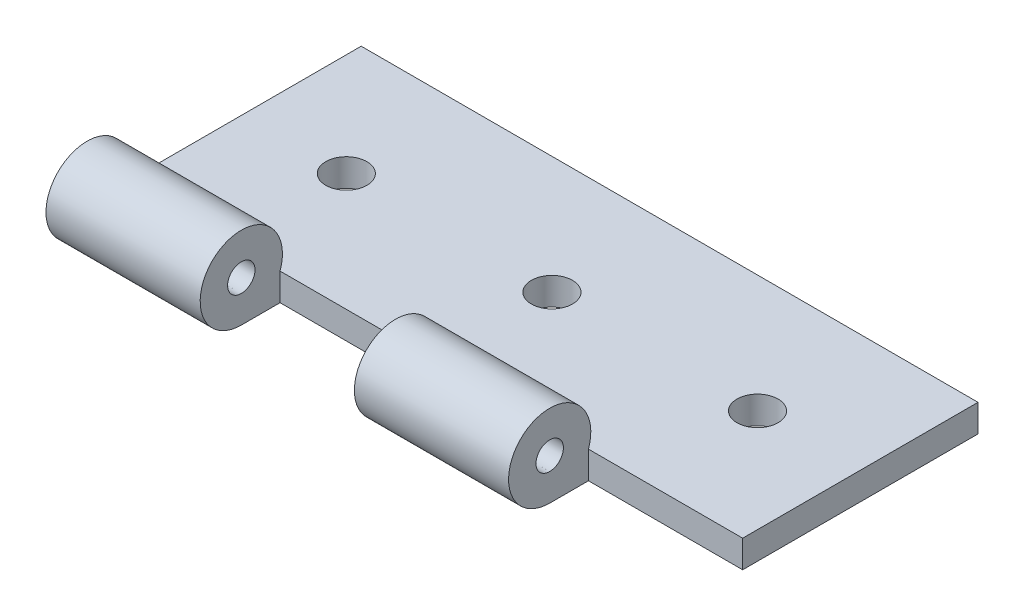
ISO-10303-21;
HEADER;
FILE_DESCRIPTION(('STEP AP214'),'2;1');
FILE_NAME('part.step','',(''),(''),'','','');
FILE_SCHEMA(('AUTOMOTIVE_DESIGN { 1 0 10303 214 1 1 1 1 }'));
ENDSEC;
DATA;
#1=APPLICATION_CONTEXT('core data for automotive mechanical design processes');
#2=APPLICATION_PROTOCOL_DEFINITION('international standard','automotive_design',2000,#1);
#3=PRODUCT_CONTEXT('',#1,'mechanical');
#4=PRODUCT('Part','Part','',(#3));
#5=PRODUCT_RELATED_PRODUCT_CATEGORY('part','',(#4));
#6=PRODUCT_DEFINITION_FORMATION('','',#4);
#7=PRODUCT_DEFINITION_CONTEXT('part definition',#1,'design');
#8=PRODUCT_DEFINITION('design','',#6,#7);
#9=PRODUCT_DEFINITION_SHAPE('','',#8);
#10=(LENGTH_UNIT() NAMED_UNIT(*) SI_UNIT(.MILLI.,.METRE.));
#11=(NAMED_UNIT(*) PLANE_ANGLE_UNIT() SI_UNIT($,.RADIAN.));
#12=(NAMED_UNIT(*) SI_UNIT($,.STERADIAN.) SOLID_ANGLE_UNIT());
#13=UNCERTAINTY_MEASURE_WITH_UNIT(LENGTH_MEASURE(1.E-05),#10,'distance_accuracy_value','');
#14=(GEOMETRIC_REPRESENTATION_CONTEXT(3) GLOBAL_UNCERTAINTY_ASSIGNED_CONTEXT((#13)) GLOBAL_UNIT_ASSIGNED_CONTEXT((#10,
#11,#12)) REPRESENTATION_CONTEXT('',''));
#15=CARTESIAN_POINT('',(0.,0.,0.));
#16=DIRECTION('',(0.,0.,1.));
#17=DIRECTION('',(1.,0.,0.));
#18=AXIS2_PLACEMENT_3D('',#15,#16,#17);
#19=CARTESIAN_POINT('',(0.,2.,0.));
#20=DIRECTION('',(0.,-1.,0.));
#21=DIRECTION('',(0.,0.,-1.));
#22=AXIS2_PLACEMENT_3D('',#19,#20,#21);
#23=PLANE('',#22);
#24=DIRECTION('',(0.,0.,1.));
#25=VECTOR('',#24,1.);
#26=CARTESIAN_POINT('',(-11.25,2.,0.));
#27=LINE('',#26,#25);
#28=CARTESIAN_POINT('',(-11.25,1.99999842928128,9.99693009611205));
#29=VERTEX_POINT('',#28);
#30=CARTESIAN_POINT('',(-11.25,2.,10.));
#31=VERTEX_POINT('',#30);
#32=EDGE_CURVE('E55',#29,#31,#27,.T.);
#33=ORIENTED_EDGE('',*,*,#32,.F.);
#34=DIRECTION('',(1.,0.,0.));
#35=VECTOR('',#34,1.);
#36=CARTESIAN_POINT('',(-22.5,1.99999921464064,9.99693009611205));
#37=LINE('',#36,#35);
#38=CARTESIAN_POINT('',(-22.5,2.,9.99693009611205));
#39=VERTEX_POINT('',#38);
#40=EDGE_CURVE('E191',#39,#29,#37,.T.);
#41=ORIENTED_EDGE('',*,*,#40,.F.);
#42=DIRECTION('',(0.,0.,1.));
#43=VECTOR('',#42,1.);
#44=CARTESIAN_POINT('',(-22.5,2.,10.));
#45=LINE('',#44,#43);
#46=CARTESIAN_POINT('',(-22.5,2.,10.));
#47=VERTEX_POINT('',#46);
#48=EDGE_CURVE('E173',#39,#47,#45,.T.);
#49=ORIENTED_EDGE('',*,*,#48,.T.);
#50=DIRECTION('',(1.,0.,0.));
#51=VECTOR('',#50,1.);
#52=CARTESIAN_POINT('',(-22.5,2.,10.));
#53=LINE('',#52,#51);
#54=EDGE_CURVE('E176',#47,#31,#53,.T.);
#55=ORIENTED_EDGE('',*,*,#54,.T.);
#56=EDGE_LOOP('',(#33,#41,#49,#55));
#57=FACE_BOUND('',#56,.T.);
#58=ADVANCED_FACE('F34',(#57),#23,.F.);
#59=CARTESIAN_POINT('',(0.,0.,0.));
#60=DIRECTION('',(0.,-1.,0.));
#61=DIRECTION('',(0.,0.,-1.));
#62=AXIS2_PLACEMENT_3D('',#59,#60,#61);
#63=PLANE('',#62);
#64=CARTESIAN_POINT('',(0.,0.,-1.41574879198329));
#65=DIRECTION('',(0.,-1.,0.));
#66=DIRECTION('',(0.,0.,-1.));
#67=AXIS2_PLACEMENT_3D('',#64,#65,#66);
#68=CIRCLE('',#67,1.5);
#69=CARTESIAN_POINT('',(0.,0.,0.0842512080167154));
#70=VERTEX_POINT('',#69);
#71=EDGE_CURVE('E236',#70,#70,#68,.T.);
#72=ORIENTED_EDGE('',*,*,#71,.F.);
#73=EDGE_LOOP('',(#72));
#74=FACE_BOUND('',#73,.T.);
#75=CARTESIAN_POINT('',(-15.,0.,-1.41574879198329));
#76=DIRECTION('',(0.,-1.,0.));
#77=DIRECTION('',(0.,0.,-1.));
#78=AXIS2_PLACEMENT_3D('',#75,#76,#77);
#79=CIRCLE('',#78,1.5);
#80=CARTESIAN_POINT('',(-15.,0.,0.0842512080167154));
#81=VERTEX_POINT('',#80);
#82=EDGE_CURVE('E194',#81,#81,#79,.T.);
#83=ORIENTED_EDGE('',*,*,#82,.F.);
#84=EDGE_LOOP('',(#83));
#85=FACE_BOUND('',#84,.T.);
#86=CARTESIAN_POINT('',(15.,0.,-1.41574879198329));
#87=DIRECTION('',(0.,-1.,0.));
#88=DIRECTION('',(0.,0.,-1.));
#89=AXIS2_PLACEMENT_3D('',#86,#87,#88);
#90=CIRCLE('',#89,1.5);
#91=CARTESIAN_POINT('',(15.,0.,0.0842512080167154));
#92=VERTEX_POINT('',#91);
#93=EDGE_CURVE('E42',#92,#92,#90,.T.);
#94=ORIENTED_EDGE('',*,*,#93,.F.);
#95=EDGE_LOOP('',(#94));
#96=FACE_BOUND('',#95,.T.);
#97=DIRECTION('',(1.,0.,0.));
#98=VECTOR('',#97,1.);
#99=CARTESIAN_POINT('',(-11.25,0.,7.16850241603342));
#100=LINE('',#99,#98);
#101=CARTESIAN_POINT('',(-11.25,0.,7.16850241603342));
#102=VERTEX_POINT('',#101);
#103=CARTESIAN_POINT('',(0.,0.,7.16850241603342));
#104=VERTEX_POINT('',#103);
#105=EDGE_CURVE('E136',#102,#104,#100,.T.);
#106=ORIENTED_EDGE('',*,*,#105,.F.);
#107=DIRECTION('',(0.,0.,-1.));
#108=VECTOR('',#107,1.);
#109=CARTESIAN_POINT('',(-11.25,0.,0.));
#110=LINE('',#109,#108);
#111=CARTESIAN_POINT('',(-11.25,0.,10.));
#112=VERTEX_POINT('',#111);
#113=EDGE_CURVE('E143',#112,#102,#110,.T.);
#114=ORIENTED_EDGE('',*,*,#113,.F.);
#115=DIRECTION('',(1.,0.,0.));
#116=VECTOR('',#115,1.);
#117=CARTESIAN_POINT('',(-22.5,0.,10.));
#118=LINE('',#117,#116);
#119=CARTESIAN_POINT('',(-22.5,0.,10.));
#120=VERTEX_POINT('',#119);
#121=EDGE_CURVE('E154',#120,#112,#118,.T.);
#122=ORIENTED_EDGE('',*,*,#121,.F.);
#123=DIRECTION('',(0.,0.,1.));
#124=VECTOR('',#123,1.);
#125=CARTESIAN_POINT('',(-22.5,0.,10.));
#126=LINE('',#125,#124);
#127=CARTESIAN_POINT('',(-22.5,0.,-10.));
#128=VERTEX_POINT('',#127);
#129=EDGE_CURVE('E181',#128,#120,#126,.T.);
#130=ORIENTED_EDGE('',*,*,#129,.F.);
#131=DIRECTION('',(-1.,0.,0.));
#132=VECTOR('',#131,1.);
#133=CARTESIAN_POINT('',(-22.5,0.,-10.));
#134=LINE('',#133,#132);
#135=CARTESIAN_POINT('',(22.5,0.,-10.));
#136=VERTEX_POINT('',#135);
#137=EDGE_CURVE('E163',#136,#128,#134,.T.);
#138=ORIENTED_EDGE('',*,*,#137,.F.);
#139=DIRECTION('',(0.,0.,-1.));
#140=VECTOR('',#139,1.);
#141=CARTESIAN_POINT('',(22.5,0.,10.));
#142=LINE('',#141,#140);
#143=CARTESIAN_POINT('',(22.5,0.,7.16850241603342));
#144=VERTEX_POINT('',#143);
#145=EDGE_CURVE('E160',#144,#136,#142,.T.);
#146=ORIENTED_EDGE('',*,*,#145,.F.);
#147=DIRECTION('',(1.,0.,0.));
#148=VECTOR('',#147,1.);
#149=CARTESIAN_POINT('',(11.25,0.,7.16850241603342));
#150=LINE('',#149,#148);
#151=CARTESIAN_POINT('',(11.25,0.,7.16850241603342));
#152=VERTEX_POINT('',#151);
#153=EDGE_CURVE('E234',#152,#144,#150,.T.);
#154=ORIENTED_EDGE('',*,*,#153,.F.);
#155=DIRECTION('',(0.,0.,-1.));
#156=VECTOR('',#155,1.);
#157=CARTESIAN_POINT('',(11.25,0.,0.));
#158=LINE('',#157,#156);
#159=CARTESIAN_POINT('',(11.25,0.,10.));
#160=VERTEX_POINT('',#159);
#161=EDGE_CURVE('E224',#160,#152,#158,.T.);
#162=ORIENTED_EDGE('',*,*,#161,.F.);
#163=CARTESIAN_POINT('',(0.,0.,10.));
#164=VERTEX_POINT('',#163);
#165=EDGE_CURVE('E183',#164,#160,#118,.T.);
#166=ORIENTED_EDGE('',*,*,#165,.F.);
#167=DIRECTION('',(0.,0.,-1.));
#168=VECTOR('',#167,1.);
#169=CARTESIAN_POINT('',(0.,0.,0.));
#170=LINE('',#169,#168);
#171=EDGE_CURVE('E211',#164,#104,#170,.T.);
#172=ORIENTED_EDGE('',*,*,#171,.T.);
#173=EDGE_LOOP('',(#106,#114,#122,#130,#138,#146,#154,#162,#166,#172));
#174=FACE_BOUND('',#173,.T.);
#175=ADVANCED_FACE('F203',(#74,#85,#96,#174),#63,.T.);
#176=CARTESIAN_POINT('',(-22.5,2.99999842928128,9.99693009611205));
#177=DIRECTION('',(1.,0.,0.));
#178=DIRECTION('',(0.,0.,-1.));
#179=AXIS2_PLACEMENT_3D('',#176,#177,#178);
#180=CYLINDRICAL_SURFACE('',#179,1.);
#181=CARTESIAN_POINT('',(-11.25,2.99999842928128,9.99693009611205));
#182=DIRECTION('',(1.,0.,0.));
#183=DIRECTION('',(0.,0.,-1.));
#184=AXIS2_PLACEMENT_3D('',#181,#182,#183);
#185=CIRCLE('',#184,1.);
#186=EDGE_CURVE('E340',#31,#29,#185,.F.);
#187=ORIENTED_EDGE('',*,*,#186,.F.);
#188=ORIENTED_EDGE('',*,*,#54,.F.);
#189=CARTESIAN_POINT('',(-22.5,2.99999842928128,9.99693009611205));
#190=DIRECTION('',(1.,0.,0.));
#191=DIRECTION('',(0.,0.,-1.));
#192=AXIS2_PLACEMENT_3D('',#189,#190,#191);
#193=CIRCLE('',#192,1.);
#194=EDGE_CURVE('E196',#39,#47,#193,.T.);
#195=ORIENTED_EDGE('',*,*,#194,.F.);
#196=ORIENTED_EDGE('',*,*,#40,.T.);
#197=EDGE_LOOP('',(#187,#188,#195,#196));
#198=FACE_BOUND('',#197,.T.);
#199=ADVANCED_FACE('F206',(#198),#180,.F.);
#200=CARTESIAN_POINT('',(-22.5,2.99999842928128,9.99693009611205));
#201=DIRECTION('',(1.,0.,0.));
#202=DIRECTION('',(0.,0.,-1.));
#203=AXIS2_PLACEMENT_3D('',#200,#201,#202);
#204=CYLINDRICAL_SURFACE('',#203,3.);
#205=ORIENTED_EDGE('',*,*,#121,.T.);
#206=CARTESIAN_POINT('',(-11.25,2.99999842928128,9.99693009611205));
#207=DIRECTION('',(1.,0.,0.));
#208=DIRECTION('',(0.,0.,-1.));
#209=AXIS2_PLACEMENT_3D('',#206,#207,#208);
#210=CIRCLE('',#209,3.);
#211=CARTESIAN_POINT('',(-11.25,2.,7.16850241603342));
#212=VERTEX_POINT('',#211);
#213=EDGE_CURVE('E141',#212,#112,#210,.T.);
#214=ORIENTED_EDGE('',*,*,#213,.F.);
#215=DIRECTION('',(1.,0.,0.));
#216=VECTOR('',#215,1.);
#217=CARTESIAN_POINT('',(-22.5,2.,7.16850241603342));
#218=LINE('',#217,#216);
#219=CARTESIAN_POINT('',(-22.5,2.,7.16850241603342));
#220=VERTEX_POINT('',#219);
#221=EDGE_CURVE('E151',#220,#212,#218,.T.);
#222=ORIENTED_EDGE('',*,*,#221,.F.);
#223=CARTESIAN_POINT('',(-22.5,2.99999842928128,9.99693009611205));
#224=DIRECTION('',(1.,0.,0.));
#225=DIRECTION('',(0.,0.,-1.));
#226=AXIS2_PLACEMENT_3D('',#223,#224,#225);
#227=CIRCLE('',#226,3.);
#228=EDGE_CURVE('E165',#220,#120,#227,.T.);
#229=ORIENTED_EDGE('',*,*,#228,.T.);
#230=EDGE_LOOP('',(#205,#214,#222,#229));
#231=FACE_BOUND('',#230,.T.);
#232=ADVANCED_FACE('F149',(#231),#204,.T.);
#233=CARTESIAN_POINT('',(0.,1.99999921464064,9.99693009611205));
#234=VERTEX_POINT('',#233);
#235=CARTESIAN_POINT('',(11.25,1.99999842928128,9.99693009611205));
#236=VERTEX_POINT('',#235);
#237=EDGE_CURVE('E190',#234,#236,#37,.T.);
#238=ORIENTED_EDGE('',*,*,#237,.F.);
#239=DIRECTION('',(0.,0.,1.));
#240=VECTOR('',#239,1.);
#241=CARTESIAN_POINT('',(0.,2.,0.));
#242=LINE('',#241,#240);
#243=CARTESIAN_POINT('',(0.,2.00000314141771,9.99999999035613));
#244=VERTEX_POINT('',#243);
#245=EDGE_CURVE('E48',#234,#244,#242,.T.);
#246=ORIENTED_EDGE('',*,*,#245,.T.);
#247=CARTESIAN_POINT('',(11.25,2.,10.));
#248=VERTEX_POINT('',#247);
#249=EDGE_CURVE('E175',#244,#248,#53,.T.);
#250=ORIENTED_EDGE('',*,*,#249,.T.);
#251=DIRECTION('',(0.,0.,1.));
#252=VECTOR('',#251,1.);
#253=CARTESIAN_POINT('',(11.25,2.,0.));
#254=LINE('',#253,#252);
#255=EDGE_CURVE('E230',#236,#248,#254,.T.);
#256=ORIENTED_EDGE('',*,*,#255,.F.);
#257=EDGE_LOOP('',(#238,#246,#250,#256));
#258=FACE_BOUND('',#257,.T.);
#259=ADVANCED_FACE('F287',(#258),#23,.F.);
#260=CARTESIAN_POINT('',(22.5,2.,10.));
#261=DIRECTION('',(-1.,0.,0.));
#262=DIRECTION('',(0.,0.,1.));
#263=AXIS2_PLACEMENT_3D('',#260,#261,#262);
#264=PLANE('',#263);
#265=DIRECTION('',(0.,-1.,0.));
#266=VECTOR('',#265,1.);
#267=CARTESIAN_POINT('',(22.5,0.,7.16850241603342));
#268=LINE('',#267,#266);
#269=CARTESIAN_POINT('',(22.5,2.,7.16850241603342));
#270=VERTEX_POINT('',#269);
#271=EDGE_CURVE('E212',#270,#144,#268,.T.);
#272=ORIENTED_EDGE('',*,*,#271,.T.);
#273=ORIENTED_EDGE('',*,*,#145,.T.);
#274=DIRECTION('',(0.,-1.,0.));
#275=VECTOR('',#274,1.);
#276=CARTESIAN_POINT('',(22.5,2.,-10.));
#277=LINE('',#276,#275);
#278=CARTESIAN_POINT('',(22.5,2.,-10.));
#279=VERTEX_POINT('',#278);
#280=EDGE_CURVE('E187',#279,#136,#277,.T.);
#281=ORIENTED_EDGE('',*,*,#280,.F.);
#282=DIRECTION('',(0.,0.,-1.));
#283=VECTOR('',#282,1.);
#284=CARTESIAN_POINT('',(22.5,2.,10.));
#285=LINE('',#284,#283);
#286=EDGE_CURVE('E169',#270,#279,#285,.T.);
#287=ORIENTED_EDGE('',*,*,#286,.F.);
#288=EDGE_LOOP('',(#272,#273,#281,#287));
#289=FACE_BOUND('',#288,.T.);
#290=ADVANCED_FACE('F262',(#289),#264,.F.);
#291=ORIENTED_EDGE('',*,*,#249,.F.);
#292=CARTESIAN_POINT('',(0.,2.99999842928128,9.99693009611205));
#293=DIRECTION('',(1.,0.,0.));
#294=DIRECTION('',(0.,0.,-1.));
#295=AXIS2_PLACEMENT_3D('',#292,#293,#294);
#296=CIRCLE('',#295,1.);
#297=EDGE_CURVE('E279',#244,#234,#296,.F.);
#298=ORIENTED_EDGE('',*,*,#297,.T.);
#299=ORIENTED_EDGE('',*,*,#237,.T.);
#300=CARTESIAN_POINT('',(11.25,2.99999842928128,9.99693009611205));
#301=DIRECTION('',(1.,0.,0.));
#302=DIRECTION('',(0.,0.,-1.));
#303=AXIS2_PLACEMENT_3D('',#300,#301,#302);
#304=CIRCLE('',#303,1.);
#305=EDGE_CURVE('E227',#248,#236,#304,.F.);
#306=ORIENTED_EDGE('',*,*,#305,.F.);
#307=EDGE_LOOP('',(#291,#298,#299,#306));
#308=FACE_BOUND('',#307,.T.);
#309=ADVANCED_FACE('F290',(#308),#180,.F.);
#310=CARTESIAN_POINT('',(0.,2.99999842928128,9.99693009611205));
#311=DIRECTION('',(1.,0.,0.));
#312=DIRECTION('',(0.,0.,-1.));
#313=AXIS2_PLACEMENT_3D('',#310,#311,#312);
#314=CIRCLE('',#313,3.);
#315=CARTESIAN_POINT('',(0.,2.,7.16850241603342));
#316=VERTEX_POINT('',#315);
#317=EDGE_CURVE('E276',#316,#164,#314,.T.);
#318=ORIENTED_EDGE('',*,*,#317,.T.);
#319=ORIENTED_EDGE('',*,*,#165,.T.);
#320=CARTESIAN_POINT('',(11.25,2.99999842928128,9.99693009611205));
#321=DIRECTION('',(1.,0.,0.));
#322=DIRECTION('',(0.,0.,-1.));
#323=AXIS2_PLACEMENT_3D('',#320,#321,#322);
#324=CIRCLE('',#323,3.);
#325=CARTESIAN_POINT('',(11.25,2.,7.16850241603342));
#326=VERTEX_POINT('',#325);
#327=EDGE_CURVE('E221',#326,#160,#324,.T.);
#328=ORIENTED_EDGE('',*,*,#327,.F.);
#329=EDGE_CURVE('E161',#316,#326,#218,.T.);
#330=ORIENTED_EDGE('',*,*,#329,.F.);
#331=EDGE_LOOP('',(#318,#319,#328,#330));
#332=FACE_BOUND('',#331,.T.);
#333=ADVANCED_FACE('F275',(#332),#204,.T.);
#334=CARTESIAN_POINT('',(15.,-43.,-1.41574879198329));
#335=DIRECTION('',(0.,1.,0.));
#336=DIRECTION('',(0.,0.,1.));
#337=AXIS2_PLACEMENT_3D('',#334,#335,#336);
#338=CYLINDRICAL_SURFACE('',#337,1.5);
#339=CARTESIAN_POINT('',(15.,2.,-1.41574879198329));
#340=DIRECTION('',(0.,1.,0.));
#341=DIRECTION('',(0.,0.,1.));
#342=AXIS2_PLACEMENT_3D('',#339,#340,#341);
#343=CIRCLE('',#342,1.5);
#344=CARTESIAN_POINT('',(15.,1.99999999999999,0.0842512080167154));
#345=VERTEX_POINT('',#344);
#346=EDGE_CURVE('E12',#345,#345,#343,.T.);
#347=CARTESIAN_POINT('',(15.,0.,0.0842512080167154));
#348=CARTESIAN_POINT('',(15.,0.0208333333333403,0.0842512080167154));
#349=CARTESIAN_POINT('',(15.,0.0416666666666736,0.0842512080167154));
#350=CARTESIAN_POINT('',(15.,0.0833333333333404,0.0842512080167154));
#351=CARTESIAN_POINT('',(15.,0.104166666666674,0.0842512080167154));
#352=CARTESIAN_POINT('',(15.,0.14583333333334,0.0842512080167154));
#353=CARTESIAN_POINT('',(15.,0.166666666666674,0.0842512080167154));
#354=CARTESIAN_POINT('',(15.,0.20833333333334,0.0842512080167154));
#355=CARTESIAN_POINT('',(15.,0.229166666666674,0.0842512080167154));
#356=CARTESIAN_POINT('',(15.,0.270833333333341,0.0842512080167154));
#357=CARTESIAN_POINT('',(15.,0.291666666666674,0.0842512080167154));
#358=CARTESIAN_POINT('',(15.,0.333333333333341,0.0842512080167154));
#359=CARTESIAN_POINT('',(15.,0.354166666666674,0.0842512080167154));
#360=CARTESIAN_POINT('',(15.,0.395833333333341,0.0842512080167154));
#361=CARTESIAN_POINT('',(15.,0.416666666666674,0.0842512080167154));
#362=CARTESIAN_POINT('',(15.,0.458333333333341,0.0842512080167154));
#363=CARTESIAN_POINT('',(15.,0.479166666666674,0.0842512080167154));
#364=CARTESIAN_POINT('',(15.,0.520833333333338,0.0842512080167154));
#365=CARTESIAN_POINT('',(15.,0.541666666666669,0.0842512080167154));
#366=CARTESIAN_POINT('',(15.,0.583333333333334,0.0842512080167154));
#367=CARTESIAN_POINT('',(15.,0.604166666666667,0.0842512080167154));
#368=CARTESIAN_POINT('',(15.,0.645833333333334,0.0842512080167154));
#369=CARTESIAN_POINT('',(15.,0.666666666666667,0.0842512080167154));
#370=CARTESIAN_POINT('',(15.,0.708333333333334,0.0842512080167154));
#371=CARTESIAN_POINT('',(15.,0.729166666666667,0.0842512080167154));
#372=CARTESIAN_POINT('',(15.,0.770833333333334,0.0842512080167154));
#373=CARTESIAN_POINT('',(15.,0.791666666666667,0.0842512080167154));
#374=CARTESIAN_POINT('',(15.,0.833333333333334,0.0842512080167154));
#375=CARTESIAN_POINT('',(15.,0.854166666666667,0.0842512080167154));
#376=CARTESIAN_POINT('',(15.,0.895833333333334,0.0842512080167154));
#377=CARTESIAN_POINT('',(15.,0.916666666666668,0.0842512080167154));
#378=CARTESIAN_POINT('',(15.,0.958333333333334,0.0842512080167154));
#379=CARTESIAN_POINT('',(15.,0.979166666666668,0.0842512080167154));
#380=CARTESIAN_POINT('',(15.,1.02083333333333,0.0842512080167154));
#381=CARTESIAN_POINT('',(15.,1.04166666666667,0.0842512080167154));
#382=CARTESIAN_POINT('',(15.,1.08333333333333,0.0842512080167154));
#383=CARTESIAN_POINT('',(15.,1.10416666666667,0.0842512080167154));
#384=CARTESIAN_POINT('',(15.,1.14583333333333,0.0842512080167154));
#385=CARTESIAN_POINT('',(15.,1.16666666666667,0.0842512080167154));
#386=CARTESIAN_POINT('',(15.,1.20833333333333,0.0842512080167154));
#387=CARTESIAN_POINT('',(15.,1.22916666666667,0.0842512080167154));
#388=CARTESIAN_POINT('',(15.,1.27083333333333,0.0842512080167154));
#389=CARTESIAN_POINT('',(15.,1.29166666666667,0.0842512080167154));
#390=CARTESIAN_POINT('',(15.,1.33333333333333,0.0842512080167154));
#391=CARTESIAN_POINT('',(15.,1.35416666666667,0.0842512080167154));
#392=CARTESIAN_POINT('',(15.,1.39583333333333,0.0842512080167154));
#393=CARTESIAN_POINT('',(15.,1.41666666666667,0.0842512080167154));
#394=CARTESIAN_POINT('',(15.,1.45833333333333,0.0842512080167154));
#395=CARTESIAN_POINT('',(15.,1.47916666666666,0.0842512080167154));
#396=CARTESIAN_POINT('',(15.,1.52083333333333,0.0842512080167154));
#397=CARTESIAN_POINT('',(15.,1.54166666666666,0.0842512080167154));
#398=CARTESIAN_POINT('',(15.,1.58333333333333,0.0842512080167154));
#399=CARTESIAN_POINT('',(15.,1.60416666666666,0.0842512080167154));
#400=CARTESIAN_POINT('',(15.,1.64583333333333,0.0842512080167154));
#401=CARTESIAN_POINT('',(15.,1.66666666666666,0.0842512080167154));
#402=CARTESIAN_POINT('',(15.,1.70833333333333,0.0842512080167154));
#403=CARTESIAN_POINT('',(15.,1.72916666666666,0.0842512080167154));
#404=CARTESIAN_POINT('',(15.,1.77083333333333,0.0842512080167154));
#405=CARTESIAN_POINT('',(15.,1.79166666666666,0.0842512080167154));
#406=CARTESIAN_POINT('',(15.,1.83333333333333,0.0842512080167154));
#407=CARTESIAN_POINT('',(15.,1.85416666666666,0.0842512080167154));
#408=CARTESIAN_POINT('',(15.,1.89583333333333,0.0842512080167154));
#409=CARTESIAN_POINT('',(15.,1.91666666666666,0.0842512080167154));
#410=CARTESIAN_POINT('',(15.,1.95833333333333,0.0842512080167154));
#411=CARTESIAN_POINT('',(15.,1.97916666666666,0.0842512080167154));
#412=CARTESIAN_POINT('',(15.,1.99999999999999,0.0842512080167154));
#413=B_SPLINE_CURVE_WITH_KNOTS('',3,(#347,#348,#349,#350,#351,#352,#353,#354,#355,#356,#357,
#358,#359,#360,#361,#362,#363,#364,#365,#366,#367,#368,#369,#370,#371,#372,#373,#374,#375,#376,
#377,#378,#379,#380,#381,#382,#383,#384,#385,#386,#387,#388,#389,#390,#391,#392,#393,#394,#395,
#396,#397,#398,#399,#400,#401,#402,#403,#404,#405,#406,#407,#408,#409,#410,#411,#412),
.UNSPECIFIED.,.F.,.F.,(4,2,2,2,2,2,2,2,2,2,2,2,2,2,2,2,2,2,2,2,2,2,2,2,2,2,2,2,2,2,2,2,4),(0.,
0.0625000000000001,0.125,0.1875,0.25,0.3125,0.375,0.4375,0.5,0.562499999999994,
0.624999999999994,0.687499999999994,0.749999999999994,0.812499999999994,0.874999999999994,
0.937499999999994,0.999999999999994,1.06249999999999,1.12499999999999,1.18749999999999,
1.24999999999999,1.31249999999999,1.37499999999999,1.43749999999999,1.49999999999999,
1.56249999999999,1.62499999999999,1.68749999999999,1.74999999999999,1.81249999999999,
1.87499999999999,1.93749999999999,1.99999999999999),.UNSPECIFIED.);
#414=EDGE_CURVE('BSEAM36',#92,#345,#413,.T.);
#415=ORIENTED_EDGE('',*,*,#93,.T.);
#416=ORIENTED_EDGE('',*,*,#346,.T.);
#417=ORIENTED_EDGE('',*,*,#414,.T.);
#418=ORIENTED_EDGE('',*,*,#414,.F.);
#419=EDGE_LOOP('',(#415,#417,#416,#418));
#420=FACE_BOUND('',#419,.T.);
#421=ADVANCED_FACE('F36',(#420),#338,.F.);
#422=CARTESIAN_POINT('',(-22.5,2.,-10.));
#423=DIRECTION('',(0.,0.,1.));
#424=DIRECTION('',(1.,0.,0.));
#425=AXIS2_PLACEMENT_3D('',#422,#423,#424);
#426=PLANE('',#425);
#427=ORIENTED_EDGE('',*,*,#137,.T.);
#428=DIRECTION('',(0.,-1.,0.));
#429=VECTOR('',#428,1.);
#430=CARTESIAN_POINT('',(-22.5,2.,-10.));
#431=LINE('',#430,#429);
#432=CARTESIAN_POINT('',(-22.5,2.,-10.));
#433=VERTEX_POINT('',#432);
#434=EDGE_CURVE('E178',#433,#128,#431,.T.);
#435=ORIENTED_EDGE('',*,*,#434,.F.);
#436=DIRECTION('',(-1.,0.,0.));
#437=VECTOR('',#436,1.);
#438=CARTESIAN_POINT('',(-22.5,2.,-10.));
#439=LINE('',#438,#437);
#440=EDGE_CURVE('E171',#279,#433,#439,.T.);
#441=ORIENTED_EDGE('',*,*,#440,.F.);
#442=ORIENTED_EDGE('',*,*,#280,.T.);
#443=EDGE_LOOP('',(#427,#435,#441,#442));
#444=FACE_BOUND('',#443,.T.);
#445=ADVANCED_FACE('F258',(#444),#426,.F.);
#446=CARTESIAN_POINT('',(-22.5,2.,10.));
#447=DIRECTION('',(1.,0.,0.));
#448=DIRECTION('',(0.,0.,-1.));
#449=AXIS2_PLACEMENT_3D('',#446,#447,#448);
#450=PLANE('',#449);
#451=ORIENTED_EDGE('',*,*,#129,.T.);
#452=ORIENTED_EDGE('',*,*,#228,.F.);
#453=EDGE_CURVE('E159',#433,#220,#45,.T.);
#454=ORIENTED_EDGE('',*,*,#453,.F.);
#455=ORIENTED_EDGE('',*,*,#434,.T.);
#456=EDGE_LOOP('',(#451,#452,#454,#455));
#457=FACE_BOUND('',#456,.T.);
#458=ORIENTED_EDGE('',*,*,#194,.T.);
#459=ORIENTED_EDGE('',*,*,#48,.F.);
#460=EDGE_LOOP('',(#458,#459));
#461=FACE_BOUND('',#460,.T.);
#462=ADVANCED_FACE('F254',(#457,#461),#450,.F.);
#463=CARTESIAN_POINT('',(0.,2.,-1.41574879198329));
#464=DIRECTION('',(0.,1.,0.));
#465=DIRECTION('',(0.,0.,1.));
#466=AXIS2_PLACEMENT_3D('',#463,#464,#465);
#467=CIRCLE('',#466,1.5);
#468=CARTESIAN_POINT('',(0.,1.99999999999999,0.0842512080167154));
#469=VERTEX_POINT('',#468);
#470=EDGE_CURVE('E241',#469,#469,#467,.T.);
#471=ORIENTED_EDGE('',*,*,#470,.F.);
#472=EDGE_LOOP('',(#471));
#473=FACE_BOUND('',#472,.T.);
#474=CARTESIAN_POINT('',(-15.,2.,-1.41574879198329));
#475=DIRECTION('',(0.,1.,0.));
#476=DIRECTION('',(0.,0.,1.));
#477=AXIS2_PLACEMENT_3D('',#474,#475,#476);
#478=CIRCLE('',#477,1.5);
#479=CARTESIAN_POINT('',(-15.,1.99999999999999,0.0842512080167154));
#480=VERTEX_POINT('',#479);
#481=EDGE_CURVE('E197',#480,#480,#478,.T.);
#482=ORIENTED_EDGE('',*,*,#481,.F.);
#483=EDGE_LOOP('',(#482));
#484=FACE_BOUND('',#483,.T.);
#485=ORIENTED_EDGE('',*,*,#453,.T.);
#486=ORIENTED_EDGE('',*,*,#221,.T.);
#487=DIRECTION('',(1.,0.,0.));
#488=VECTOR('',#487,1.);
#489=CARTESIAN_POINT('',(-11.25,2.,7.16850241603342));
#490=LINE('',#489,#488);
#491=EDGE_CURVE('E126',#212,#316,#490,.T.);
#492=ORIENTED_EDGE('',*,*,#491,.T.);
#493=ORIENTED_EDGE('',*,*,#329,.T.);
#494=DIRECTION('',(1.,0.,0.));
#495=VECTOR('',#494,1.);
#496=CARTESIAN_POINT('',(11.25,2.,7.16850241603342));
#497=LINE('',#496,#495);
#498=EDGE_CURVE('E232',#326,#270,#497,.T.);
#499=ORIENTED_EDGE('',*,*,#498,.T.);
#500=ORIENTED_EDGE('',*,*,#286,.T.);
#501=ORIENTED_EDGE('',*,*,#440,.T.);
#502=EDGE_LOOP('',(#485,#486,#492,#493,#499,#500,#501));
#503=FACE_BOUND('',#502,.T.);
#504=ORIENTED_EDGE('',*,*,#346,.F.);
#505=EDGE_LOOP('',(#504));
#506=FACE_BOUND('',#505,.T.);
#507=ADVANCED_FACE('F156',(#473,#484,#503,#506),#23,.F.);
#508=CARTESIAN_POINT('',(-15.,-43.,-1.41574879198329));
#509=DIRECTION('',(0.,1.,0.));
#510=DIRECTION('',(0.,0.,1.));
#511=AXIS2_PLACEMENT_3D('',#508,#509,#510);
#512=CYLINDRICAL_SURFACE('',#511,1.5);
#513=CARTESIAN_POINT('',(-15.,0.,0.0842512080167154));
#514=CARTESIAN_POINT('',(-15.,0.0208333333333403,0.0842512080167154));
#515=CARTESIAN_POINT('',(-15.,0.0416666666666736,0.0842512080167154));
#516=CARTESIAN_POINT('',(-15.,0.0833333333333404,0.0842512080167154));
#517=CARTESIAN_POINT('',(-15.,0.104166666666674,0.0842512080167154));
#518=CARTESIAN_POINT('',(-15.,0.14583333333334,0.0842512080167154));
#519=CARTESIAN_POINT('',(-15.,0.166666666666674,0.0842512080167154));
#520=CARTESIAN_POINT('',(-15.,0.20833333333334,0.0842512080167154));
#521=CARTESIAN_POINT('',(-15.,0.229166666666674,0.0842512080167154));
#522=CARTESIAN_POINT('',(-15.,0.270833333333341,0.0842512080167154));
#523=CARTESIAN_POINT('',(-15.,0.291666666666674,0.0842512080167154));
#524=CARTESIAN_POINT('',(-15.,0.333333333333341,0.0842512080167154));
#525=CARTESIAN_POINT('',(-15.,0.354166666666674,0.0842512080167154));
#526=CARTESIAN_POINT('',(-15.,0.395833333333341,0.0842512080167154));
#527=CARTESIAN_POINT('',(-15.,0.416666666666674,0.0842512080167154));
#528=CARTESIAN_POINT('',(-15.,0.458333333333341,0.0842512080167154));
#529=CARTESIAN_POINT('',(-15.,0.479166666666674,0.0842512080167154));
#530=CARTESIAN_POINT('',(-15.,0.520833333333338,0.0842512080167154));
#531=CARTESIAN_POINT('',(-15.,0.541666666666669,0.0842512080167154));
#532=CARTESIAN_POINT('',(-15.,0.583333333333334,0.0842512080167154));
#533=CARTESIAN_POINT('',(-15.,0.604166666666667,0.0842512080167154));
#534=CARTESIAN_POINT('',(-15.,0.645833333333334,0.0842512080167154));
#535=CARTESIAN_POINT('',(-15.,0.666666666666667,0.0842512080167154));
#536=CARTESIAN_POINT('',(-15.,0.708333333333334,0.0842512080167154));
#537=CARTESIAN_POINT('',(-15.,0.729166666666667,0.0842512080167154));
#538=CARTESIAN_POINT('',(-15.,0.770833333333334,0.0842512080167154));
#539=CARTESIAN_POINT('',(-15.,0.791666666666667,0.0842512080167154));
#540=CARTESIAN_POINT('',(-15.,0.833333333333334,0.0842512080167154));
#541=CARTESIAN_POINT('',(-15.,0.854166666666667,0.0842512080167154));
#542=CARTESIAN_POINT('',(-15.,0.895833333333334,0.0842512080167154));
#543=CARTESIAN_POINT('',(-15.,0.916666666666668,0.0842512080167154));
#544=CARTESIAN_POINT('',(-15.,0.958333333333334,0.0842512080167154));
#545=CARTESIAN_POINT('',(-15.,0.979166666666668,0.0842512080167154));
#546=CARTESIAN_POINT('',(-15.,1.02083333333333,0.0842512080167154));
#547=CARTESIAN_POINT('',(-15.,1.04166666666667,0.0842512080167154));
#548=CARTESIAN_POINT('',(-15.,1.08333333333333,0.0842512080167154));
#549=CARTESIAN_POINT('',(-15.,1.10416666666667,0.0842512080167154));
#550=CARTESIAN_POINT('',(-15.,1.14583333333333,0.0842512080167154));
#551=CARTESIAN_POINT('',(-15.,1.16666666666667,0.0842512080167154));
#552=CARTESIAN_POINT('',(-15.,1.20833333333333,0.0842512080167154));
#553=CARTESIAN_POINT('',(-15.,1.22916666666667,0.0842512080167154));
#554=CARTESIAN_POINT('',(-15.,1.27083333333333,0.0842512080167154));
#555=CARTESIAN_POINT('',(-15.,1.29166666666667,0.0842512080167154));
#556=CARTESIAN_POINT('',(-15.,1.33333333333333,0.0842512080167154));
#557=CARTESIAN_POINT('',(-15.,1.35416666666667,0.0842512080167154));
#558=CARTESIAN_POINT('',(-15.,1.39583333333333,0.0842512080167154));
#559=CARTESIAN_POINT('',(-15.,1.41666666666667,0.0842512080167154));
#560=CARTESIAN_POINT('',(-15.,1.45833333333333,0.0842512080167154));
#561=CARTESIAN_POINT('',(-15.,1.47916666666666,0.0842512080167154));
#562=CARTESIAN_POINT('',(-15.,1.52083333333333,0.0842512080167154));
#563=CARTESIAN_POINT('',(-15.,1.54166666666666,0.0842512080167154));
#564=CARTESIAN_POINT('',(-15.,1.58333333333333,0.0842512080167154));
#565=CARTESIAN_POINT('',(-15.,1.60416666666666,0.0842512080167154));
#566=CARTESIAN_POINT('',(-15.,1.64583333333333,0.0842512080167154));
#567=CARTESIAN_POINT('',(-15.,1.66666666666666,0.0842512080167154));
#568=CARTESIAN_POINT('',(-15.,1.70833333333333,0.0842512080167154));
#569=CARTESIAN_POINT('',(-15.,1.72916666666666,0.0842512080167154));
#570=CARTESIAN_POINT('',(-15.,1.77083333333333,0.0842512080167154));
#571=CARTESIAN_POINT('',(-15.,1.79166666666666,0.0842512080167154));
#572=CARTESIAN_POINT('',(-15.,1.83333333333333,0.0842512080167154));
#573=CARTESIAN_POINT('',(-15.,1.85416666666666,0.0842512080167154));
#574=CARTESIAN_POINT('',(-15.,1.89583333333333,0.0842512080167154));
#575=CARTESIAN_POINT('',(-15.,1.91666666666666,0.0842512080167154));
#576=CARTESIAN_POINT('',(-15.,1.95833333333333,0.0842512080167154));
#577=CARTESIAN_POINT('',(-15.,1.97916666666666,0.0842512080167154));
#578=CARTESIAN_POINT('',(-15.,1.99999999999999,0.0842512080167154));
#579=B_SPLINE_CURVE_WITH_KNOTS('',3,(#513,#514,#515,#516,#517,#518,#519,#520,#521,#522,#523,
#524,#525,#526,#527,#528,#529,#530,#531,#532,#533,#534,#535,#536,#537,#538,#539,#540,#541,#542,
#543,#544,#545,#546,#547,#548,#549,#550,#551,#552,#553,#554,#555,#556,#557,#558,#559,#560,#561,
#562,#563,#564,#565,#566,#567,#568,#569,#570,#571,#572,#573,#574,#575,#576,#577,#578),
.UNSPECIFIED.,.F.,.F.,(4,2,2,2,2,2,2,2,2,2,2,2,2,2,2,2,2,2,2,2,2,2,2,2,2,2,2,2,2,2,2,2,4),(0.,
0.0625000000000001,0.125,0.1875,0.25,0.3125,0.375,0.4375,0.5,0.562499999999994,
0.624999999999994,0.687499999999994,0.749999999999994,0.812499999999994,0.874999999999994,
0.937499999999994,0.999999999999994,1.06249999999999,1.12499999999999,1.18749999999999,
1.24999999999999,1.31249999999999,1.37499999999999,1.43749999999999,1.49999999999999,
1.56249999999999,1.62499999999999,1.68749999999999,1.74999999999999,1.81249999999999,
1.87499999999999,1.93749999999999,1.99999999999999),.UNSPECIFIED.);
#580=EDGE_CURVE('BSEAM308',#81,#480,#579,.T.);
#581=ORIENTED_EDGE('',*,*,#82,.T.);
#582=ORIENTED_EDGE('',*,*,#481,.T.);
#583=ORIENTED_EDGE('',*,*,#580,.T.);
#584=ORIENTED_EDGE('',*,*,#580,.F.);
#585=EDGE_LOOP('',(#581,#583,#582,#584));
#586=FACE_BOUND('',#585,.T.);
#587=ADVANCED_FACE('F308',(#586),#512,.F.);
#588=CARTESIAN_POINT('',(0.,-43.,-1.41574879198329));
#589=DIRECTION('',(0.,1.,0.));
#590=DIRECTION('',(0.,0.,1.));
#591=AXIS2_PLACEMENT_3D('',#588,#589,#590);
#592=CYLINDRICAL_SURFACE('',#591,1.5);
#593=CARTESIAN_POINT('',(0.,0.,0.0842512080167154));
#594=CARTESIAN_POINT('',(0.,0.0208333333333403,0.0842512080167154));
#595=CARTESIAN_POINT('',(0.,0.0416666666666736,0.0842512080167154));
#596=CARTESIAN_POINT('',(0.,0.0833333333333404,0.0842512080167154));
#597=CARTESIAN_POINT('',(0.,0.104166666666674,0.0842512080167154));
#598=CARTESIAN_POINT('',(0.,0.14583333333334,0.0842512080167154));
#599=CARTESIAN_POINT('',(0.,0.166666666666674,0.0842512080167154));
#600=CARTESIAN_POINT('',(0.,0.20833333333334,0.0842512080167154));
#601=CARTESIAN_POINT('',(0.,0.229166666666674,0.0842512080167154));
#602=CARTESIAN_POINT('',(0.,0.270833333333341,0.0842512080167154));
#603=CARTESIAN_POINT('',(0.,0.291666666666674,0.0842512080167154));
#604=CARTESIAN_POINT('',(0.,0.333333333333341,0.0842512080167154));
#605=CARTESIAN_POINT('',(0.,0.354166666666674,0.0842512080167154));
#606=CARTESIAN_POINT('',(0.,0.395833333333341,0.0842512080167154));
#607=CARTESIAN_POINT('',(0.,0.416666666666674,0.0842512080167154));
#608=CARTESIAN_POINT('',(0.,0.458333333333341,0.0842512080167154));
#609=CARTESIAN_POINT('',(0.,0.479166666666674,0.0842512080167154));
#610=CARTESIAN_POINT('',(0.,0.520833333333338,0.0842512080167154));
#611=CARTESIAN_POINT('',(0.,0.541666666666669,0.0842512080167154));
#612=CARTESIAN_POINT('',(0.,0.583333333333334,0.0842512080167154));
#613=CARTESIAN_POINT('',(0.,0.604166666666667,0.0842512080167154));
#614=CARTESIAN_POINT('',(0.,0.645833333333334,0.0842512080167154));
#615=CARTESIAN_POINT('',(0.,0.666666666666667,0.0842512080167154));
#616=CARTESIAN_POINT('',(0.,0.708333333333334,0.0842512080167154));
#617=CARTESIAN_POINT('',(0.,0.729166666666667,0.0842512080167154));
#618=CARTESIAN_POINT('',(0.,0.770833333333334,0.0842512080167154));
#619=CARTESIAN_POINT('',(0.,0.791666666666667,0.0842512080167154));
#620=CARTESIAN_POINT('',(0.,0.833333333333334,0.0842512080167154));
#621=CARTESIAN_POINT('',(0.,0.854166666666667,0.0842512080167154));
#622=CARTESIAN_POINT('',(0.,0.895833333333334,0.0842512080167154));
#623=CARTESIAN_POINT('',(0.,0.916666666666668,0.0842512080167154));
#624=CARTESIAN_POINT('',(0.,0.958333333333334,0.0842512080167154));
#625=CARTESIAN_POINT('',(0.,0.979166666666668,0.0842512080167154));
#626=CARTESIAN_POINT('',(0.,1.02083333333333,0.0842512080167154));
#627=CARTESIAN_POINT('',(0.,1.04166666666667,0.0842512080167154));
#628=CARTESIAN_POINT('',(0.,1.08333333333333,0.0842512080167154));
#629=CARTESIAN_POINT('',(0.,1.10416666666667,0.0842512080167154));
#630=CARTESIAN_POINT('',(0.,1.14583333333333,0.0842512080167154));
#631=CARTESIAN_POINT('',(0.,1.16666666666667,0.0842512080167154));
#632=CARTESIAN_POINT('',(0.,1.20833333333333,0.0842512080167154));
#633=CARTESIAN_POINT('',(0.,1.22916666666667,0.0842512080167154));
#634=CARTESIAN_POINT('',(0.,1.27083333333333,0.0842512080167154));
#635=CARTESIAN_POINT('',(0.,1.29166666666667,0.0842512080167154));
#636=CARTESIAN_POINT('',(0.,1.33333333333333,0.0842512080167154));
#637=CARTESIAN_POINT('',(0.,1.35416666666667,0.0842512080167154));
#638=CARTESIAN_POINT('',(0.,1.39583333333333,0.0842512080167154));
#639=CARTESIAN_POINT('',(0.,1.41666666666667,0.0842512080167154));
#640=CARTESIAN_POINT('',(0.,1.45833333333333,0.0842512080167154));
#641=CARTESIAN_POINT('',(0.,1.47916666666666,0.0842512080167154));
#642=CARTESIAN_POINT('',(0.,1.52083333333333,0.0842512080167154));
#643=CARTESIAN_POINT('',(0.,1.54166666666666,0.0842512080167154));
#644=CARTESIAN_POINT('',(0.,1.58333333333333,0.0842512080167154));
#645=CARTESIAN_POINT('',(0.,1.60416666666666,0.0842512080167154));
#646=CARTESIAN_POINT('',(0.,1.64583333333333,0.0842512080167154));
#647=CARTESIAN_POINT('',(0.,1.66666666666666,0.0842512080167154));
#648=CARTESIAN_POINT('',(0.,1.70833333333333,0.0842512080167154));
#649=CARTESIAN_POINT('',(0.,1.72916666666666,0.0842512080167154));
#650=CARTESIAN_POINT('',(0.,1.77083333333333,0.0842512080167154));
#651=CARTESIAN_POINT('',(0.,1.79166666666666,0.0842512080167154));
#652=CARTESIAN_POINT('',(0.,1.83333333333333,0.0842512080167154));
#653=CARTESIAN_POINT('',(0.,1.85416666666666,0.0842512080167154));
#654=CARTESIAN_POINT('',(0.,1.89583333333333,0.0842512080167154));
#655=CARTESIAN_POINT('',(0.,1.91666666666666,0.0842512080167154));
#656=CARTESIAN_POINT('',(0.,1.95833333333333,0.0842512080167154));
#657=CARTESIAN_POINT('',(0.,1.97916666666666,0.0842512080167154));
#658=CARTESIAN_POINT('',(0.,1.99999999999999,0.0842512080167154));
#659=B_SPLINE_CURVE_WITH_KNOTS('',3,(#593,#594,#595,#596,#597,#598,#599,#600,#601,#602,#603,
#604,#605,#606,#607,#608,#609,#610,#611,#612,#613,#614,#615,#616,#617,#618,#619,#620,#621,#622,
#623,#624,#625,#626,#627,#628,#629,#630,#631,#632,#633,#634,#635,#636,#637,#638,#639,#640,#641,
#642,#643,#644,#645,#646,#647,#648,#649,#650,#651,#652,#653,#654,#655,#656,#657,#658),
.UNSPECIFIED.,.F.,.F.,(4,2,2,2,2,2,2,2,2,2,2,2,2,2,2,2,2,2,2,2,2,2,2,2,2,2,2,2,2,2,2,2,4),(0.,
0.0625000000000001,0.125,0.1875,0.25,0.3125,0.375,0.4375,0.5,0.562499999999994,
0.624999999999994,0.687499999999994,0.749999999999994,0.812499999999994,0.874999999999994,
0.937499999999994,0.999999999999994,1.06249999999999,1.12499999999999,1.18749999999999,
1.24999999999999,1.31249999999999,1.37499999999999,1.43749999999999,1.49999999999999,
1.56249999999999,1.62499999999999,1.68749999999999,1.74999999999999,1.81249999999999,
1.87499999999999,1.93749999999999,1.99999999999999),.UNSPECIFIED.);
#660=EDGE_CURVE('BSEAM298',#70,#469,#659,.T.);
#661=ORIENTED_EDGE('',*,*,#71,.T.);
#662=ORIENTED_EDGE('',*,*,#470,.T.);
#663=ORIENTED_EDGE('',*,*,#660,.T.);
#664=ORIENTED_EDGE('',*,*,#660,.F.);
#665=EDGE_LOOP('',(#661,#663,#662,#664));
#666=FACE_BOUND('',#665,.T.);
#667=ADVANCED_FACE('F298',(#666),#592,.F.);
#668=CARTESIAN_POINT('',(11.25,0.,7.16850241603342));
#669=DIRECTION('',(0.,0.,1.));
#670=DIRECTION('',(1.,0.,0.));
#671=AXIS2_PLACEMENT_3D('',#668,#669,#670);
#672=PLANE('',#671);
#673=ORIENTED_EDGE('',*,*,#271,.F.);
#674=ORIENTED_EDGE('',*,*,#498,.F.);
#675=DIRECTION('',(0.,-1.,0.));
#676=VECTOR('',#675,1.);
#677=CARTESIAN_POINT('',(11.25,0.,7.16850241603342));
#678=LINE('',#677,#676);
#679=EDGE_CURVE('E215',#326,#152,#678,.T.);
#680=ORIENTED_EDGE('',*,*,#679,.T.);
#681=ORIENTED_EDGE('',*,*,#153,.T.);
#682=EDGE_LOOP('',(#673,#674,#680,#681));
#683=FACE_BOUND('',#682,.T.);
#684=ADVANCED_FACE('F266',(#683),#672,.T.);
#685=CARTESIAN_POINT('',(11.25,0.,0.));
#686=DIRECTION('',(1.,0.,0.));
#687=DIRECTION('',(0.,0.,-1.));
#688=AXIS2_PLACEMENT_3D('',#685,#686,#687);
#689=PLANE('',#688);
#690=ORIENTED_EDGE('',*,*,#679,.F.);
#691=ORIENTED_EDGE('',*,*,#327,.T.);
#692=ORIENTED_EDGE('',*,*,#161,.T.);
#693=EDGE_LOOP('',(#690,#691,#692));
#694=FACE_BOUND('',#693,.T.);
#695=ORIENTED_EDGE('',*,*,#305,.T.);
#696=ORIENTED_EDGE('',*,*,#255,.T.);
#697=EDGE_LOOP('',(#695,#696));
#698=FACE_BOUND('',#697,.T.);
#699=ADVANCED_FACE('F271',(#694,#698),#689,.T.);
#700=CARTESIAN_POINT('',(-11.25,0.,7.16850241603342));
#701=DIRECTION('',(0.,0.,1.));
#702=DIRECTION('',(1.,0.,0.));
#703=AXIS2_PLACEMENT_3D('',#700,#701,#702);
#704=PLANE('',#703);
#705=DIRECTION('',(0.,-1.,0.));
#706=VECTOR('',#705,1.);
#707=CARTESIAN_POINT('',(0.,0.,7.16850241603342));
#708=LINE('',#707,#706);
#709=EDGE_CURVE('E132',#316,#104,#708,.T.);
#710=ORIENTED_EDGE('',*,*,#709,.F.);
#711=ORIENTED_EDGE('',*,*,#491,.F.);
#712=DIRECTION('',(0.,-1.,0.));
#713=VECTOR('',#712,1.);
#714=CARTESIAN_POINT('',(-11.25,0.,7.16850241603342));
#715=LINE('',#714,#713);
#716=EDGE_CURVE('E129',#212,#102,#715,.T.);
#717=ORIENTED_EDGE('',*,*,#716,.T.);
#718=ORIENTED_EDGE('',*,*,#105,.T.);
#719=EDGE_LOOP('',(#710,#711,#717,#718));
#720=FACE_BOUND('',#719,.T.);
#721=ADVANCED_FACE('F128',(#720),#704,.T.);
#722=CARTESIAN_POINT('',(-11.25,0.,0.));
#723=DIRECTION('',(1.,0.,0.));
#724=DIRECTION('',(0.,0.,-1.));
#725=AXIS2_PLACEMENT_3D('',#722,#723,#724);
#726=PLANE('',#725);
#727=ORIENTED_EDGE('',*,*,#716,.F.);
#728=ORIENTED_EDGE('',*,*,#213,.T.);
#729=ORIENTED_EDGE('',*,*,#113,.T.);
#730=EDGE_LOOP('',(#727,#728,#729));
#731=FACE_BOUND('',#730,.T.);
#732=ORIENTED_EDGE('',*,*,#186,.T.);
#733=ORIENTED_EDGE('',*,*,#32,.T.);
#734=EDGE_LOOP('',(#732,#733));
#735=FACE_BOUND('',#734,.T.);
#736=ADVANCED_FACE('F140',(#731,#735),#726,.T.);
#737=CARTESIAN_POINT('',(0.,0.,0.));
#738=DIRECTION('',(1.,0.,0.));
#739=DIRECTION('',(0.,0.,-1.));
#740=AXIS2_PLACEMENT_3D('',#737,#738,#739);
#741=PLANE('',#740);
#742=ORIENTED_EDGE('',*,*,#709,.T.);
#743=ORIENTED_EDGE('',*,*,#171,.F.);
#744=ORIENTED_EDGE('',*,*,#317,.F.);
#745=EDGE_LOOP('',(#742,#743,#744));
#746=FACE_BOUND('',#745,.T.);
#747=ORIENTED_EDGE('',*,*,#297,.F.);
#748=ORIENTED_EDGE('',*,*,#245,.F.);
#749=EDGE_LOOP('',(#747,#748));
#750=FACE_BOUND('',#749,.T.);
#751=ADVANCED_FACE('F344',(#746,#750),#741,.F.);
#752=CLOSED_SHELL('',(#58,#175,#199,#232,#259,#290,#309,#333,#421,#445,#462,#507,#587,#667,#684,
#699,#721,#736,#751));
#753=MANIFOLD_SOLID_BREP('B2',#752);
#754=ADVANCED_BREP_SHAPE_REPRESENTATION('',(#18,#753),#14);
#755=SHAPE_DEFINITION_REPRESENTATION(#9,#754);
ENDSEC;
END-ISO-10303-21;
